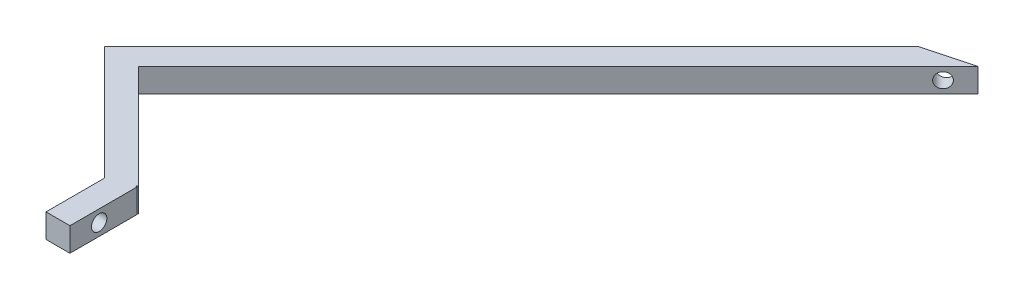
ISO-10303-21;
HEADER;
FILE_DESCRIPTION(('STEP AP214'),'2;1');
FILE_NAME('part.step','',(''),(''),'','','');
FILE_SCHEMA(('AUTOMOTIVE_DESIGN { 1 0 10303 214 1 1 1 1 }'));
ENDSEC;
DATA;
#1=APPLICATION_CONTEXT('core data for automotive mechanical design processes');
#2=APPLICATION_PROTOCOL_DEFINITION('international standard','automotive_design',2000,#1);
#3=PRODUCT_CONTEXT('',#1,'mechanical');
#4=PRODUCT('Part','Part','',(#3));
#5=PRODUCT_RELATED_PRODUCT_CATEGORY('part','',(#4));
#6=PRODUCT_DEFINITION_FORMATION('','',#4);
#7=PRODUCT_DEFINITION_CONTEXT('part definition',#1,'design');
#8=PRODUCT_DEFINITION('design','',#6,#7);
#9=PRODUCT_DEFINITION_SHAPE('','',#8);
#10=(LENGTH_UNIT() NAMED_UNIT(*) SI_UNIT(.MILLI.,.METRE.));
#11=(NAMED_UNIT(*) PLANE_ANGLE_UNIT() SI_UNIT($,.RADIAN.));
#12=(NAMED_UNIT(*) SI_UNIT($,.STERADIAN.) SOLID_ANGLE_UNIT());
#13=UNCERTAINTY_MEASURE_WITH_UNIT(LENGTH_MEASURE(1.E-05),#10,'distance_accuracy_value','');
#14=(GEOMETRIC_REPRESENTATION_CONTEXT(3) GLOBAL_UNCERTAINTY_ASSIGNED_CONTEXT((#13)) GLOBAL_UNIT_ASSIGNED_CONTEXT((#10,
#11,#12)) REPRESENTATION_CONTEXT('',''));
#15=CARTESIAN_POINT('',(0.,0.,0.));
#16=DIRECTION('',(0.,0.,1.));
#17=DIRECTION('',(1.,0.,0.));
#18=AXIS2_PLACEMENT_3D('',#15,#16,#17);
#19=CARTESIAN_POINT('',(-147.271192020746,-0.00999999999999959,110.472946406711));
#20=DIRECTION('',(0.258819045102527,0.,0.965925826289067));
#21=DIRECTION('',(0.965925826289067,0.,-0.258819045102527));
#22=AXIS2_PLACEMENT_3D('',#19,#20,#21);
#23=PLANE('',#22);
#24=CARTESIAN_POINT('',(-141.694416662494,3.5,108.978653953098));
#25=DIRECTION('',(0.258819045102527,0.,0.965925826289067));
#26=DIRECTION('',(-0.965925826289067,0.,0.258819045102527));
#27=AXIS2_PLACEMENT_3D('',#24,#25,#26);
#28=ELLIPSE('',#27,2.4826061575154,2.15000000000001);
#29=CARTESIAN_POINT('',(-144.092430066542,3.5,109.621199708151));
#30=VERTEX_POINT('',#29);
#31=EDGE_CURVE('E136',#30,#30,#28,.F.);
#32=ORIENTED_EDGE('',*,*,#31,.F.);
#33=EDGE_LOOP('',(#32));
#34=FACE_BOUND('',#33,.T.);
#35=DIRECTION('',(0.,-1.,0.));
#36=VECTOR('',#35,1.);
#37=CARTESIAN_POINT('',(-147.271192020746,7.,110.472946406711));
#38=LINE('',#37,#36);
#39=CARTESIAN_POINT('',(-147.271192020746,7.,110.472946406711));
#40=VERTEX_POINT('',#39);
#41=CARTESIAN_POINT('',(-147.271192020746,0.,110.472946406711));
#42=VERTEX_POINT('',#41);
#43=EDGE_CURVE('E204',#40,#42,#38,.T.);
#44=ORIENTED_EDGE('',*,*,#43,.F.);
#45=DIRECTION('',(0.965925826289067,0.,-0.258819045102527));
#46=VECTOR('',#45,1.);
#47=CARTESIAN_POINT('',(17.752937359096,7.,66.2548642077321));
#48=LINE('',#47,#46);
#49=CARTESIAN_POINT('',(-133.610937982901,7.,106.812692368866));
#50=VERTEX_POINT('',#49);
#51=EDGE_CURVE('E49',#40,#50,#48,.T.);
#52=ORIENTED_EDGE('',*,*,#51,.T.);
#53=DIRECTION('',(0.,-1.,0.));
#54=VECTOR('',#53,1.);
#55=CARTESIAN_POINT('',(-133.610937982901,7.,106.812692368866));
#56=LINE('',#55,#54);
#57=CARTESIAN_POINT('',(-133.610937982901,0.,106.812692368866));
#58=VERTEX_POINT('',#57);
#59=EDGE_CURVE('E11',#50,#58,#56,.T.);
#60=ORIENTED_EDGE('',*,*,#59,.T.);
#61=DIRECTION('',(0.965925826289067,0.,-0.258819045102527));
#62=VECTOR('',#61,1.);
#63=CARTESIAN_POINT('',(17.752937359096,0.,66.2548642077321));
#64=LINE('',#63,#62);
#65=EDGE_CURVE('E44',#42,#58,#64,.T.);
#66=ORIENTED_EDGE('',*,*,#65,.F.);
#67=EDGE_LOOP('',(#44,#52,#60,#66));
#68=FACE_BOUND('',#67,.T.);
#69=ADVANCED_FACE('F41',(#34,#68),#23,.F.);
#70=CARTESIAN_POINT('',(-226.113598123046,3.5,271.475778095972));
#71=DIRECTION('',(-1.,0.,0.));
#72=DIRECTION('',(0.,0.,1.));
#73=AXIS2_PLACEMENT_3D('',#70,#71,#72);
#74=CYLINDRICAL_SURFACE('',#73,2.24999999999995);
#75=CARTESIAN_POINT('',(-226.113598123046,3.5,271.475778095972));
#76=DIRECTION('',(-1.,0.,0.));
#77=DIRECTION('',(0.,0.,1.));
#78=AXIS2_PLACEMENT_3D('',#75,#76,#77);
#79=CIRCLE('',#78,2.24999999999995);
#80=CARTESIAN_POINT('',(-226.113598123046,3.5,273.725778095972));
#81=VERTEX_POINT('',#80);
#82=EDGE_CURVE('E164',#81,#81,#79,.T.);
#83=ORIENTED_EDGE('',*,*,#82,.F.);
#84=EDGE_LOOP('',(#83));
#85=FACE_BOUND('',#84,.T.);
#86=CARTESIAN_POINT('',(-233.113598123046,3.5,271.475778095972));
#87=DIRECTION('',(-1.,0.,0.));
#88=DIRECTION('',(0.,0.,1.));
#89=AXIS2_PLACEMENT_3D('',#86,#87,#88);
#90=CIRCLE('',#89,2.24999999999995);
#91=CARTESIAN_POINT('',(-233.113598123046,3.5,273.725778095972));
#92=VERTEX_POINT('',#91);
#93=EDGE_CURVE('E201',#92,#92,#90,.T.);
#94=ORIENTED_EDGE('',*,*,#93,.T.);
#95=EDGE_LOOP('',(#94));
#96=FACE_BOUND('',#95,.T.);
#97=ADVANCED_FACE('F247',(#85,#96),#74,.F.);
#98=CARTESIAN_POINT('',(16.9562162523099,7.,16.9562162523099));
#99=DIRECTION('',(0.707106781186547,0.,0.707106781186547));
#100=DIRECTION('',(0.707106781186548,0.,-0.707106781186548));
#101=AXIS2_PLACEMENT_3D('',#98,#99,#100);
#102=PLANE('',#101);
#103=DIRECTION('',(-0.707106781186548,0.,0.707106781186548));
#104=VECTOR('',#103,1.);
#105=CARTESIAN_POINT('',(16.9562162523099,0.,16.9562162523099));
#106=LINE('',#105,#104);
#107=CARTESIAN_POINT('',(-226.113598123046,0.,260.026030627666));
#108=VERTEX_POINT('',#107);
#109=CARTESIAN_POINT('',(-226.435177530265,0.,260.347610034884));
#110=VERTEX_POINT('',#109);
#111=EDGE_CURVE('E178',#108,#110,#106,.T.);
#112=ORIENTED_EDGE('',*,*,#111,.F.);
#113=DIRECTION('',(0.,-1.,0.));
#114=VECTOR('',#113,1.);
#115=CARTESIAN_POINT('',(-226.113598123046,7.,260.026030627666));
#116=LINE('',#115,#114);
#117=CARTESIAN_POINT('',(-226.113598123046,7.,260.026030627666));
#118=VERTEX_POINT('',#117);
#119=EDGE_CURVE('E187',#118,#108,#116,.T.);
#120=ORIENTED_EDGE('',*,*,#119,.F.);
#121=DIRECTION('',(-0.707106781186548,0.,0.707106781186548));
#122=VECTOR('',#121,1.);
#123=CARTESIAN_POINT('',(16.9562162523099,7.,16.9562162523099));
#124=LINE('',#123,#122);
#125=CARTESIAN_POINT('',(-226.435177530265,7.,260.347610034884));
#126=VERTEX_POINT('',#125);
#127=EDGE_CURVE('E153',#118,#126,#124,.T.);
#128=ORIENTED_EDGE('',*,*,#127,.T.);
#129=DIRECTION('',(0.,-1.,0.));
#130=VECTOR('',#129,1.);
#131=CARTESIAN_POINT('',(-226.435177530265,7.,260.347610034884));
#132=LINE('',#131,#130);
#133=EDGE_CURVE('E189',#126,#110,#132,.T.);
#134=ORIENTED_EDGE('',*,*,#133,.T.);
#135=EDGE_LOOP('',(#112,#120,#128,#134));
#136=FACE_BOUND('',#135,.T.);
#137=ADVANCED_FACE('F227',(#136),#102,.T.);
#138=CARTESIAN_POINT('',(0.,7.,260.347610034884));
#139=DIRECTION('',(0.,0.,1.));
#140=DIRECTION('',(1.,0.,0.));
#141=AXIS2_PLACEMENT_3D('',#138,#139,#140);
#142=PLANE('',#141);
#143=DIRECTION('',(-1.,0.,0.));
#144=VECTOR('',#143,1.);
#145=CARTESIAN_POINT('',(0.,0.,260.347610034884));
#146=LINE('',#145,#144);
#147=CARTESIAN_POINT('',(-226.113598123046,0.,260.347610034884));
#148=VERTEX_POINT('',#147);
#149=EDGE_CURVE('E175',#148,#110,#146,.T.);
#150=ORIENTED_EDGE('',*,*,#149,.T.);
#151=ORIENTED_EDGE('',*,*,#133,.F.);
#152=DIRECTION('',(-1.,0.,0.));
#153=VECTOR('',#152,1.);
#154=CARTESIAN_POINT('',(0.,7.,260.347610034884));
#155=LINE('',#154,#153);
#156=CARTESIAN_POINT('',(-226.113598123046,7.,260.347610034884));
#157=VERTEX_POINT('',#156);
#158=EDGE_CURVE('E151',#157,#126,#155,.T.);
#159=ORIENTED_EDGE('',*,*,#158,.F.);
#160=DIRECTION('',(0.,-1.,0.));
#161=VECTOR('',#160,1.);
#162=CARTESIAN_POINT('',(-226.113598123046,7.,260.347610034884));
#163=LINE('',#162,#161);
#164=EDGE_CURVE('E191',#157,#148,#163,.T.);
#165=ORIENTED_EDGE('',*,*,#164,.T.);
#166=EDGE_LOOP('',(#150,#151,#159,#165));
#167=FACE_BOUND('',#166,.T.);
#168=ADVANCED_FACE('F223',(#167),#142,.F.);
#169=CARTESIAN_POINT('',(-226.113598123046,7.,0.));
#170=DIRECTION('',(1.,0.,0.));
#171=DIRECTION('',(0.,0.,-1.));
#172=AXIS2_PLACEMENT_3D('',#169,#170,#171);
#173=PLANE('',#172);
#174=ORIENTED_EDGE('',*,*,#82,.T.);
#175=EDGE_LOOP('',(#174));
#176=FACE_BOUND('',#175,.T.);
#177=DIRECTION('',(0.,0.,1.));
#178=VECTOR('',#177,1.);
#179=CARTESIAN_POINT('',(-226.113598123046,0.,0.));
#180=LINE('',#179,#178);
#181=CARTESIAN_POINT('',(-226.113598123046,0.,280.026030627666));
#182=VERTEX_POINT('',#181);
#183=EDGE_CURVE('E172',#148,#182,#180,.T.);
#184=ORIENTED_EDGE('',*,*,#183,.F.);
#185=ORIENTED_EDGE('',*,*,#164,.F.);
#186=DIRECTION('',(0.,0.,1.));
#187=VECTOR('',#186,1.);
#188=CARTESIAN_POINT('',(-226.113598123046,7.,0.));
#189=LINE('',#188,#187);
#190=CARTESIAN_POINT('',(-226.113598123046,7.,280.026030627666));
#191=VERTEX_POINT('',#190);
#192=EDGE_CURVE('E148',#157,#191,#189,.T.);
#193=ORIENTED_EDGE('',*,*,#192,.T.);
#194=DIRECTION('',(0.,-1.,0.));
#195=VECTOR('',#194,1.);
#196=CARTESIAN_POINT('',(-226.113598123046,7.,280.026030627666));
#197=LINE('',#196,#195);
#198=EDGE_CURVE('E193',#191,#182,#197,.T.);
#199=ORIENTED_EDGE('',*,*,#198,.T.);
#200=EDGE_LOOP('',(#184,#185,#193,#199));
#201=FACE_BOUND('',#200,.T.);
#202=ADVANCED_FACE('F217',(#176,#201),#173,.T.);
#203=CARTESIAN_POINT('',(0.,7.,280.026030627666));
#204=DIRECTION('',(0.,0.,1.));
#205=DIRECTION('',(1.,0.,0.));
#206=AXIS2_PLACEMENT_3D('',#203,#204,#205);
#207=PLANE('',#206);
#208=DIRECTION('',(-1.,0.,0.));
#209=VECTOR('',#208,1.);
#210=CARTESIAN_POINT('',(0.,0.,280.026030627666));
#211=LINE('',#210,#209);
#212=CARTESIAN_POINT('',(-233.113598123046,0.,280.026030627666));
#213=VERTEX_POINT('',#212);
#214=EDGE_CURVE('E169',#182,#213,#211,.T.);
#215=ORIENTED_EDGE('',*,*,#214,.F.);
#216=ORIENTED_EDGE('',*,*,#198,.F.);
#217=DIRECTION('',(-1.,0.,0.));
#218=VECTOR('',#217,1.);
#219=CARTESIAN_POINT('',(0.,7.,280.026030627666));
#220=LINE('',#219,#218);
#221=CARTESIAN_POINT('',(-233.113598123046,7.,280.026030627666));
#222=VERTEX_POINT('',#221);
#223=EDGE_CURVE('E142',#191,#222,#220,.T.);
#224=ORIENTED_EDGE('',*,*,#223,.T.);
#225=DIRECTION('',(0.,-1.,0.));
#226=VECTOR('',#225,1.);
#227=CARTESIAN_POINT('',(-233.113598123046,7.,280.026030627666));
#228=LINE('',#227,#226);
#229=EDGE_CURVE('E195',#222,#213,#228,.T.);
#230=ORIENTED_EDGE('',*,*,#229,.T.);
#231=EDGE_LOOP('',(#215,#216,#224,#230));
#232=FACE_BOUND('',#231,.T.);
#233=ADVANCED_FACE('F214',(#232),#207,.T.);
#234=CARTESIAN_POINT('',(-233.113598123046,7.,0.));
#235=DIRECTION('',(-1.,0.,0.));
#236=DIRECTION('',(0.,0.,1.));
#237=AXIS2_PLACEMENT_3D('',#234,#235,#236);
#238=PLANE('',#237);
#239=ORIENTED_EDGE('',*,*,#93,.F.);
#240=EDGE_LOOP('',(#239));
#241=FACE_BOUND('',#240,.T.);
#242=DIRECTION('',(0.,0.,-1.));
#243=VECTOR('',#242,1.);
#244=CARTESIAN_POINT('',(-233.113598123046,0.,0.));
#245=LINE('',#244,#243);
#246=CARTESIAN_POINT('',(-233.113598123046,0.,262.925525564278));
#247=VERTEX_POINT('',#246);
#248=EDGE_CURVE('E166',#213,#247,#245,.T.);
#249=ORIENTED_EDGE('',*,*,#248,.F.);
#250=ORIENTED_EDGE('',*,*,#229,.F.);
#251=DIRECTION('',(0.,0.,-1.));
#252=VECTOR('',#251,1.);
#253=CARTESIAN_POINT('',(-233.113598123046,7.,0.));
#254=LINE('',#253,#252);
#255=CARTESIAN_POINT('',(-233.113598123046,7.,262.925525564278));
#256=VERTEX_POINT('',#255);
#257=EDGE_CURVE('E140',#222,#256,#254,.T.);
#258=ORIENTED_EDGE('',*,*,#257,.T.);
#259=DIRECTION('',(0.,-1.,0.));
#260=VECTOR('',#259,1.);
#261=CARTESIAN_POINT('',(-233.113598123046,7.,262.925525564278));
#262=LINE('',#261,#260);
#263=EDGE_CURVE('E137',#256,#247,#262,.T.);
#264=ORIENTED_EDGE('',*,*,#263,.T.);
#265=EDGE_LOOP('',(#249,#250,#258,#264));
#266=FACE_BOUND('',#265,.T.);
#267=ADVANCED_FACE('F210',(#241,#266),#238,.T.);
#268=CARTESIAN_POINT('',(-248.019561843662,7.,248.019561843662));
#269=DIRECTION('',(-0.707106781186547,0.,0.707106781186548));
#270=DIRECTION('',(0.707106781186548,0.,0.707106781186547));
#271=AXIS2_PLACEMENT_3D('',#268,#269,#270);
#272=PLANE('',#271);
#273=DIRECTION('',(-0.707106781186548,0.,-0.707106781186547));
#274=VECTOR('',#273,1.);
#275=CARTESIAN_POINT('',(-248.019561843662,0.,248.019561843662));
#276=LINE('',#275,#274);
#277=CARTESIAN_POINT('',(-266.418684650679,0.,229.620439036644));
#278=VERTEX_POINT('',#277);
#279=EDGE_CURVE('E163',#247,#278,#276,.T.);
#280=ORIENTED_EDGE('',*,*,#279,.F.);
#281=ORIENTED_EDGE('',*,*,#263,.F.);
#282=DIRECTION('',(-0.707106781186548,0.,-0.707106781186547));
#283=VECTOR('',#282,1.);
#284=CARTESIAN_POINT('',(-248.019561843662,7.,248.019561843662));
#285=LINE('',#284,#283);
#286=CARTESIAN_POINT('',(-266.418684650679,7.,229.620439036644));
#287=VERTEX_POINT('',#286);
#288=EDGE_CURVE('E121',#256,#287,#285,.T.);
#289=ORIENTED_EDGE('',*,*,#288,.T.);
#290=DIRECTION('',(0.,-1.,0.));
#291=VECTOR('',#290,1.);
#292=CARTESIAN_POINT('',(-266.418684650679,7.,229.620439036644));
#293=LINE('',#292,#291);
#294=EDGE_CURVE('E130',#287,#278,#293,.T.);
#295=ORIENTED_EDGE('',*,*,#294,.T.);
#296=EDGE_LOOP('',(#280,#281,#289,#295));
#297=FACE_BOUND('',#296,.T.);
#298=ADVANCED_FACE('F139',(#297),#272,.T.);
#299=CARTESIAN_POINT('',(-18.3991228070176,7.,-18.3991228070176));
#300=DIRECTION('',(0.707106781186547,0.,0.707106781186547));
#301=DIRECTION('',(0.707106781186548,0.,-0.707106781186548));
#302=AXIS2_PLACEMENT_3D('',#299,#300,#301);
#303=PLANE('',#302);
#304=DIRECTION('',(-0.707106781186548,0.,0.707106781186548));
#305=VECTOR('',#304,1.);
#306=CARTESIAN_POINT('',(-18.3991228070176,7.,-18.3991228070176));
#307=LINE('',#306,#305);
#308=EDGE_CURVE('E116',#40,#287,#307,.T.);
#309=ORIENTED_EDGE('',*,*,#308,.F.);
#310=ORIENTED_EDGE('',*,*,#43,.T.);
#311=DIRECTION('',(-0.707106781186548,0.,0.707106781186548));
#312=VECTOR('',#311,1.);
#313=CARTESIAN_POINT('',(-18.3991228070176,0.,-18.3991228070176));
#314=LINE('',#313,#312);
#315=EDGE_CURVE('E132',#42,#278,#314,.T.);
#316=ORIENTED_EDGE('',*,*,#315,.T.);
#317=ORIENTED_EDGE('',*,*,#294,.F.);
#318=EDGE_LOOP('',(#309,#310,#316,#317));
#319=FACE_BOUND('',#318,.T.);
#320=ADVANCED_FACE('F131',(#319),#303,.F.);
#321=CARTESIAN_POINT('',(0.,0.,0.));
#322=DIRECTION('',(0.,1.,0.));
#323=DIRECTION('',(0.,0.,1.));
#324=AXIS2_PLACEMENT_3D('',#321,#322,#323);
#325=PLANE('',#324);
#326=ORIENTED_EDGE('',*,*,#315,.F.);
#327=ORIENTED_EDGE('',*,*,#65,.T.);
#328=DIRECTION('',(-0.707106781186546,0.,0.707106781186549));
#329=VECTOR('',#328,1.);
#330=CARTESIAN_POINT('',(-13.3991228070176,0.,-13.3991228070175));
#331=LINE('',#330,#329);
#332=CARTESIAN_POINT('',(-256.468937182373,0.,229.670691568339));
#333=VERTEX_POINT('',#332);
#334=EDGE_CURVE('E127',#58,#333,#331,.T.);
#335=ORIENTED_EDGE('',*,*,#334,.T.);
#336=DIRECTION('',(0.707106781186547,0.,0.707106781186548));
#337=VECTOR('',#336,1.);
#338=CARTESIAN_POINT('',(-243.069814375356,0.,243.069814375356));
#339=LINE('',#338,#337);
#340=EDGE_CURVE('E181',#333,#108,#339,.T.);
#341=ORIENTED_EDGE('',*,*,#340,.T.);
#342=ORIENTED_EDGE('',*,*,#111,.T.);
#343=ORIENTED_EDGE('',*,*,#149,.F.);
#344=ORIENTED_EDGE('',*,*,#183,.T.);
#345=ORIENTED_EDGE('',*,*,#214,.T.);
#346=ORIENTED_EDGE('',*,*,#248,.T.);
#347=ORIENTED_EDGE('',*,*,#279,.T.);
#348=EDGE_LOOP('',(#326,#327,#335,#341,#342,#343,#344,#345,#346,#347));
#349=FACE_BOUND('',#348,.T.);
#350=ADVANCED_FACE('F206',(#349),#325,.F.);
#351=CARTESIAN_POINT('',(-243.069814375356,7.,243.069814375356));
#352=DIRECTION('',(0.707106781186548,0.,-0.707106781186547));
#353=DIRECTION('',(-0.707106781186547,0.,-0.707106781186548));
#354=AXIS2_PLACEMENT_3D('',#351,#352,#353);
#355=PLANE('',#354);
#356=ORIENTED_EDGE('',*,*,#340,.F.);
#357=DIRECTION('',(0.,-1.,0.));
#358=VECTOR('',#357,1.);
#359=CARTESIAN_POINT('',(-256.468937182373,7.,229.670691568339));
#360=LINE('',#359,#358);
#361=CARTESIAN_POINT('',(-256.468937182373,7.,229.670691568339));
#362=VERTEX_POINT('',#361);
#363=EDGE_CURVE('E161',#362,#333,#360,.T.);
#364=ORIENTED_EDGE('',*,*,#363,.F.);
#365=DIRECTION('',(0.707106781186547,0.,0.707106781186548));
#366=VECTOR('',#365,1.);
#367=CARTESIAN_POINT('',(-243.069814375356,7.,243.069814375356));
#368=LINE('',#367,#366);
#369=EDGE_CURVE('E156',#362,#118,#368,.T.);
#370=ORIENTED_EDGE('',*,*,#369,.T.);
#371=ORIENTED_EDGE('',*,*,#119,.T.);
#372=EDGE_LOOP('',(#356,#364,#370,#371));
#373=FACE_BOUND('',#372,.T.);
#374=ADVANCED_FACE('F230',(#373),#355,.T.);
#375=CARTESIAN_POINT('',(0.,7.,0.));
#376=DIRECTION('',(0.,1.,0.));
#377=DIRECTION('',(0.,0.,1.));
#378=AXIS2_PLACEMENT_3D('',#375,#376,#377);
#379=PLANE('',#378);
#380=ORIENTED_EDGE('',*,*,#51,.F.);
#381=ORIENTED_EDGE('',*,*,#308,.T.);
#382=ORIENTED_EDGE('',*,*,#288,.F.);
#383=ORIENTED_EDGE('',*,*,#257,.F.);
#384=ORIENTED_EDGE('',*,*,#223,.F.);
#385=ORIENTED_EDGE('',*,*,#192,.F.);
#386=ORIENTED_EDGE('',*,*,#158,.T.);
#387=ORIENTED_EDGE('',*,*,#127,.F.);
#388=ORIENTED_EDGE('',*,*,#369,.F.);
#389=DIRECTION('',(-0.707106781186546,0.,0.707106781186549));
#390=VECTOR('',#389,1.);
#391=CARTESIAN_POINT('',(-13.3991228070176,7.,-13.3991228070175));
#392=LINE('',#391,#390);
#393=EDGE_CURVE('E159',#50,#362,#392,.T.);
#394=ORIENTED_EDGE('',*,*,#393,.F.);
#395=EDGE_LOOP('',(#380,#381,#382,#383,#384,#385,#386,#387,#388,#394));
#396=FACE_BOUND('',#395,.T.);
#397=ADVANCED_FACE('F118',(#396),#379,.T.);
#398=CARTESIAN_POINT('',(-13.3991228070176,7.,-13.3991228070175));
#399=DIRECTION('',(0.707106781186549,0.,0.707106781186546));
#400=DIRECTION('',(0.707106781186546,0.,-0.707106781186549));
#401=AXIS2_PLACEMENT_3D('',#398,#399,#400);
#402=PLANE('',#401);
#403=ORIENTED_EDGE('',*,*,#59,.F.);
#404=ORIENTED_EDGE('',*,*,#393,.T.);
#405=ORIENTED_EDGE('',*,*,#363,.T.);
#406=ORIENTED_EDGE('',*,*,#334,.F.);
#407=EDGE_LOOP('',(#403,#404,#405,#406));
#408=FACE_BOUND('',#407,.T.);
#409=CARTESIAN_POINT('',(-138.735658114813,3.5,111.937412500778));
#410=DIRECTION('',(0.707106781186549,0.,0.707106781186546));
#411=DIRECTION('',(0.707106781186546,0.,-0.707106781186549));
#412=AXIS2_PLACEMENT_3D('',#409,#410,#411);
#413=CIRCLE('',#412,2.15000000000001);
#414=CARTESIAN_POINT('',(-137.215378535262,3.5,110.417132921227));
#415=VERTEX_POINT('',#414);
#416=EDGE_CURVE('E198',#415,#415,#413,.T.);
#417=ORIENTED_EDGE('',*,*,#416,.F.);
#418=EDGE_LOOP('',(#417));
#419=FACE_BOUND('',#418,.T.);
#420=ADVANCED_FACE('F232',(#408,#419),#402,.T.);
#421=CARTESIAN_POINT('',(-136.664590302948,3.5,114.008480312644));
#422=DIRECTION('',(-0.707106781186548,0.,-0.707106781186547));
#423=DIRECTION('',(-0.707106781186547,0.,0.707106781186548));
#424=AXIS2_PLACEMENT_3D('',#421,#422,#423);
#425=CYLINDRICAL_SURFACE('',#424,2.15000000000001);
#426=ORIENTED_EDGE('',*,*,#31,.T.);
#427=EDGE_LOOP('',(#426));
#428=FACE_BOUND('',#427,.T.);
#429=ORIENTED_EDGE('',*,*,#416,.T.);
#430=EDGE_LOOP('',(#429));
#431=FACE_BOUND('',#430,.T.);
#432=ADVANCED_FACE('F235',(#428,#431),#425,.F.);
#433=CLOSED_SHELL('',(#69,#97,#137,#168,#202,#233,#267,#298,#320,#350,#374,#397,#420,#432));
#434=MANIFOLD_SOLID_BREP('B2',#433);
#435=ADVANCED_BREP_SHAPE_REPRESENTATION('',(#18,#434),#14);
#436=SHAPE_DEFINITION_REPRESENTATION(#9,#435);
ENDSEC;
END-ISO-10303-21;
